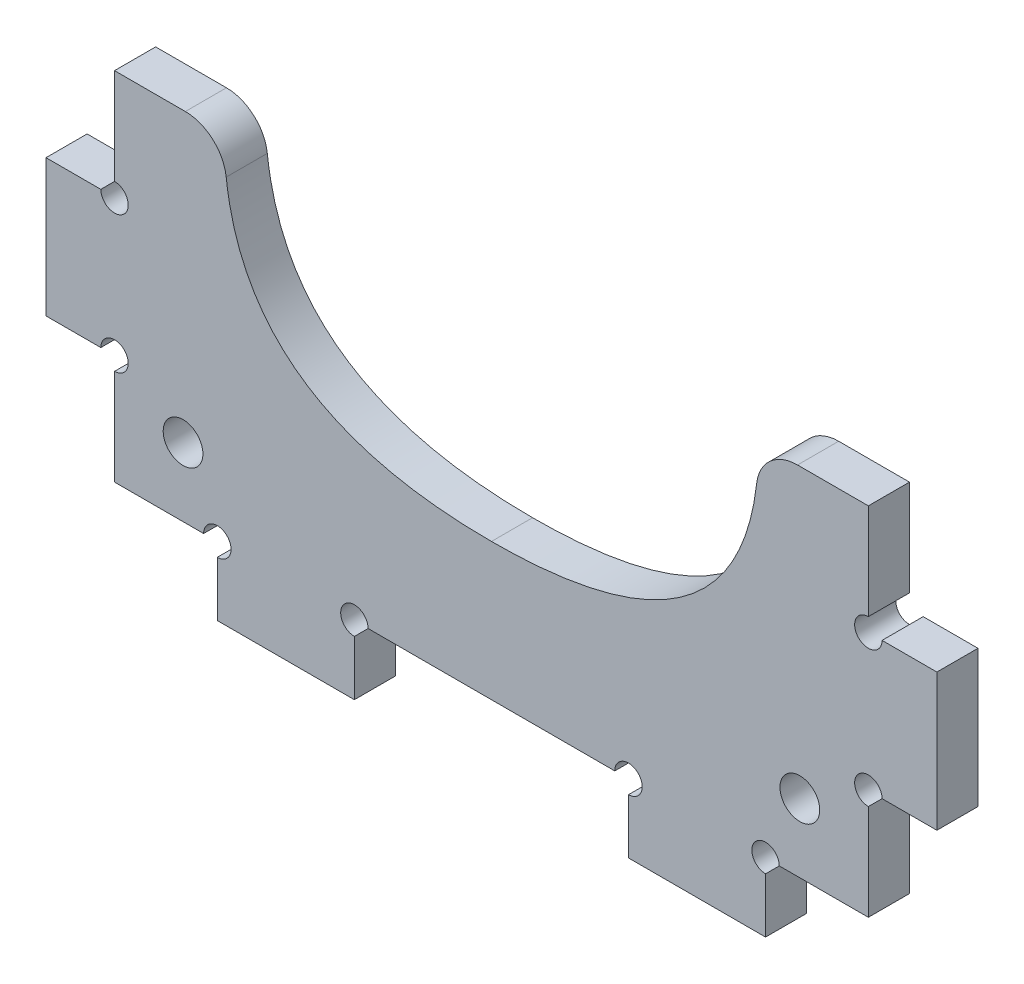
ISO-10303-21;
HEADER;
FILE_DESCRIPTION(('STEP AP214'),'2;1');
FILE_NAME('part.step','',(''),(''),'','','');
FILE_SCHEMA(('AUTOMOTIVE_DESIGN { 1 0 10303 214 1 1 1 1 }'));
ENDSEC;
DATA;
#1=APPLICATION_CONTEXT('core data for automotive mechanical design processes');
#2=APPLICATION_PROTOCOL_DEFINITION('international standard','automotive_design',2000,#1);
#3=PRODUCT_CONTEXT('',#1,'mechanical');
#4=PRODUCT('Part','Part','',(#3));
#5=PRODUCT_RELATED_PRODUCT_CATEGORY('part','',(#4));
#6=PRODUCT_DEFINITION_FORMATION('','',#4);
#7=PRODUCT_DEFINITION_CONTEXT('part definition',#1,'design');
#8=PRODUCT_DEFINITION('design','',#6,#7);
#9=PRODUCT_DEFINITION_SHAPE('','',#8);
#10=(LENGTH_UNIT() NAMED_UNIT(*) SI_UNIT(.MILLI.,.METRE.));
#11=(NAMED_UNIT(*) PLANE_ANGLE_UNIT() SI_UNIT($,.RADIAN.));
#12=(NAMED_UNIT(*) SI_UNIT($,.STERADIAN.) SOLID_ANGLE_UNIT());
#13=UNCERTAINTY_MEASURE_WITH_UNIT(LENGTH_MEASURE(1.E-05),#10,'distance_accuracy_value','');
#14=(GEOMETRIC_REPRESENTATION_CONTEXT(3) GLOBAL_UNCERTAINTY_ASSIGNED_CONTEXT((#13)) GLOBAL_UNIT_ASSIGNED_CONTEXT((#10,
#11,#12)) REPRESENTATION_CONTEXT('',''));
#15=CARTESIAN_POINT('',(0.,0.,0.));
#16=DIRECTION('',(0.,0.,1.));
#17=DIRECTION('',(1.,0.,0.));
#18=AXIS2_PLACEMENT_3D('',#15,#16,#17);
#19=CARTESIAN_POINT('',(14.625,14.,3.));
#20=DIRECTION('',(0.,0.,1.));
#21=DIRECTION('',(1.,0.,0.));
#22=AXIS2_PLACEMENT_3D('',#19,#20,#21);
#23=PLANE('',#22);
#24=DIRECTION('',(-1.,0.,0.));
#25=VECTOR('',#24,1.);
#26=CARTESIAN_POINT('',(27.5,26.,3.));
#27=LINE('',#26,#25);
#28=CARTESIAN_POINT('',(27.5,26.,3.));
#29=VERTEX_POINT('',#28);
#30=CARTESIAN_POINT('',(22.3334164182917,26.,3.));
#31=VERTEX_POINT('',#30);
#32=EDGE_CURVE('E622',#29,#31,#27,.T.);
#33=ORIENTED_EDGE('',*,*,#32,.T.);
#34=CARTESIAN_POINT('',(22.3334164182917,23.,3.));
#35=DIRECTION('',(0.,0.,1.));
#36=DIRECTION('',(1.,0.,0.));
#37=AXIS2_PLACEMENT_3D('',#34,#35,#36);
#38=CIRCLE('',#37,3.);
#39=CARTESIAN_POINT('',(19.3533116213821,23.3449281076346,3.));
#40=VERTEX_POINT('',#39);
#41=EDGE_CURVE('E478',#31,#40,#38,.T.);
#42=ORIENTED_EDGE('',*,*,#41,.T.);
#43=CARTESIAN_POINT('',(19.5,26.,3.));
#44=CARTESIAN_POINT('',(19.5,10.,3.));
#45=CARTESIAN_POINT('',(0.,10.,3.));
#46=B_SPLINE_CURVE_WITH_KNOTS('',2,(#43,#44,#45),.UNSPECIFIED.,.F.,.F.,(3,3),(0.,1.),.UNSPECIFIED.);
#47=CARTESIAN_POINT('',(0.,10.,3.));
#48=VERTEX_POINT('',#47);
#49=EDGE_CURVE('E625',#40,#48,#46,.T.);
#50=ORIENTED_EDGE('',*,*,#49,.T.);
#51=CARTESIAN_POINT('',(0.,10.,3.));
#52=CARTESIAN_POINT('',(-19.5,10.,3.));
#53=CARTESIAN_POINT('',(-19.5,26.,3.));
#54=B_SPLINE_CURVE_WITH_KNOTS('',2,(#51,#52,#53),.UNSPECIFIED.,.F.,.F.,(3,3),(0.,1.),.UNSPECIFIED.);
#55=CARTESIAN_POINT('',(-19.3533116213821,23.3449281076346,3.));
#56=VERTEX_POINT('',#55);
#57=EDGE_CURVE('E513',#48,#56,#54,.T.);
#58=ORIENTED_EDGE('',*,*,#57,.T.);
#59=CARTESIAN_POINT('',(-22.3334164182917,23.,3.));
#60=DIRECTION('',(0.,0.,1.));
#61=DIRECTION('',(1.,0.,0.));
#62=AXIS2_PLACEMENT_3D('',#59,#60,#61);
#63=CIRCLE('',#62,3.);
#64=CARTESIAN_POINT('',(-22.3334164182917,26.,3.));
#65=VERTEX_POINT('',#64);
#66=EDGE_CURVE('E61',#56,#65,#63,.T.);
#67=ORIENTED_EDGE('',*,*,#66,.T.);
#68=DIRECTION('',(-1.,0.,0.));
#69=VECTOR('',#68,1.);
#70=CARTESIAN_POINT('',(-27.5,26.,3.));
#71=LINE('',#70,#69);
#72=CARTESIAN_POINT('',(-27.5,26.,3.));
#73=VERTEX_POINT('',#72);
#74=EDGE_CURVE('E487',#65,#73,#71,.T.);
#75=ORIENTED_EDGE('',*,*,#74,.T.);
#76=DIRECTION('',(0.,-1.,0.));
#77=VECTOR('',#76,1.);
#78=CARTESIAN_POINT('',(-27.5,18.,3.));
#79=LINE('',#78,#77);
#80=CARTESIAN_POINT('',(-27.5,19.,3.));
#81=VERTEX_POINT('',#80);
#82=EDGE_CURVE('E504',#73,#81,#79,.T.);
#83=ORIENTED_EDGE('',*,*,#82,.T.);
#84=CARTESIAN_POINT('',(-27.5,18.,3.));
#85=DIRECTION('',(0.,0.,1.));
#86=DIRECTION('',(1.,0.,0.));
#87=AXIS2_PLACEMENT_3D('',#84,#85,#86);
#88=CIRCLE('',#87,1.);
#89=CARTESIAN_POINT('',(-28.5,18.,3.));
#90=VERTEX_POINT('',#89);
#91=EDGE_CURVE('E573',#90,#81,#88,.T.);
#92=ORIENTED_EDGE('',*,*,#91,.F.);
#93=DIRECTION('',(-1.,0.,0.));
#94=VECTOR('',#93,1.);
#95=CARTESIAN_POINT('',(-32.5,18.,3.));
#96=LINE('',#95,#94);
#97=CARTESIAN_POINT('',(-32.5,18.,3.));
#98=VERTEX_POINT('',#97);
#99=EDGE_CURVE('E507',#90,#98,#96,.T.);
#100=ORIENTED_EDGE('',*,*,#99,.T.);
#101=DIRECTION('',(0.,-1.,0.));
#102=VECTOR('',#101,1.);
#103=CARTESIAN_POINT('',(-32.5,8.,3.));
#104=LINE('',#103,#102);
#105=CARTESIAN_POINT('',(-32.5,8.,3.));
#106=VERTEX_POINT('',#105);
#107=EDGE_CURVE('E511',#98,#106,#104,.T.);
#108=ORIENTED_EDGE('',*,*,#107,.T.);
#109=DIRECTION('',(1.,0.,0.));
#110=VECTOR('',#109,1.);
#111=CARTESIAN_POINT('',(-27.5,8.,3.));
#112=LINE('',#111,#110);
#113=CARTESIAN_POINT('',(-28.5,8.,3.));
#114=VERTEX_POINT('',#113);
#115=EDGE_CURVE('E519',#106,#114,#112,.T.);
#116=ORIENTED_EDGE('',*,*,#115,.T.);
#117=CARTESIAN_POINT('',(-27.5,8.,3.));
#118=DIRECTION('',(0.,0.,1.));
#119=DIRECTION('',(1.,0.,0.));
#120=AXIS2_PLACEMENT_3D('',#117,#118,#119);
#121=CIRCLE('',#120,1.);
#122=CARTESIAN_POINT('',(-27.5,7.,3.));
#123=VERTEX_POINT('',#122);
#124=EDGE_CURVE('E794',#123,#114,#121,.T.);
#125=ORIENTED_EDGE('',*,*,#124,.F.);
#126=DIRECTION('',(0.,-1.,0.));
#127=VECTOR('',#126,1.);
#128=CARTESIAN_POINT('',(-27.5,0.,3.));
#129=LINE('',#128,#127);
#130=CARTESIAN_POINT('',(-27.5,0.,3.));
#131=VERTEX_POINT('',#130);
#132=EDGE_CURVE('E523',#123,#131,#129,.T.);
#133=ORIENTED_EDGE('',*,*,#132,.T.);
#134=DIRECTION('',(1.,0.,0.));
#135=VECTOR('',#134,1.);
#136=CARTESIAN_POINT('',(-20.,0.,3.));
#137=LINE('',#136,#135);
#138=CARTESIAN_POINT('',(-21.,0.,3.));
#139=VERTEX_POINT('',#138);
#140=EDGE_CURVE('E526',#131,#139,#137,.T.);
#141=ORIENTED_EDGE('',*,*,#140,.T.);
#142=CARTESIAN_POINT('',(-20.,0.,3.));
#143=DIRECTION('',(0.,0.,1.));
#144=DIRECTION('',(1.,0.,0.));
#145=AXIS2_PLACEMENT_3D('',#142,#143,#144);
#146=CIRCLE('',#145,1.);
#147=CARTESIAN_POINT('',(-20.,-1.,3.));
#148=VERTEX_POINT('',#147);
#149=EDGE_CURVE('E787',#148,#139,#146,.T.);
#150=ORIENTED_EDGE('',*,*,#149,.F.);
#151=DIRECTION('',(0.,-1.,0.));
#152=VECTOR('',#151,1.);
#153=CARTESIAN_POINT('',(-20.,-5.,3.));
#154=LINE('',#153,#152);
#155=CARTESIAN_POINT('',(-20.,-5.,3.));
#156=VERTEX_POINT('',#155);
#157=EDGE_CURVE('E530',#148,#156,#154,.T.);
#158=ORIENTED_EDGE('',*,*,#157,.T.);
#159=DIRECTION('',(1.,0.,0.));
#160=VECTOR('',#159,1.);
#161=CARTESIAN_POINT('',(-10.,-5.,3.));
#162=LINE('',#161,#160);
#163=CARTESIAN_POINT('',(-10.,-5.,3.));
#164=VERTEX_POINT('',#163);
#165=EDGE_CURVE('E533',#156,#164,#162,.T.);
#166=ORIENTED_EDGE('',*,*,#165,.T.);
#167=DIRECTION('',(0.,1.,0.));
#168=VECTOR('',#167,1.);
#169=CARTESIAN_POINT('',(-10.,0.,3.));
#170=LINE('',#169,#168);
#171=CARTESIAN_POINT('',(-10.,-1.,3.));
#172=VERTEX_POINT('',#171);
#173=EDGE_CURVE('E536',#164,#172,#170,.T.);
#174=ORIENTED_EDGE('',*,*,#173,.T.);
#175=CARTESIAN_POINT('',(-10.,0.,3.));
#176=DIRECTION('',(0.,0.,1.));
#177=DIRECTION('',(1.,0.,0.));
#178=AXIS2_PLACEMENT_3D('',#175,#176,#177);
#179=CIRCLE('',#178,1.);
#180=CARTESIAN_POINT('',(-9.,0.,3.));
#181=VERTEX_POINT('',#180);
#182=EDGE_CURVE('E780',#181,#172,#179,.T.);
#183=ORIENTED_EDGE('',*,*,#182,.F.);
#184=DIRECTION('',(1.,0.,0.));
#185=VECTOR('',#184,1.);
#186=CARTESIAN_POINT('',(-10.,0.,3.));
#187=LINE('',#186,#185);
#188=CARTESIAN_POINT('',(9.,0.,3.));
#189=VERTEX_POINT('',#188);
#190=EDGE_CURVE('E540',#181,#189,#187,.T.);
#191=ORIENTED_EDGE('',*,*,#190,.T.);
#192=CARTESIAN_POINT('',(10.,0.,3.));
#193=DIRECTION('',(0.,0.,1.));
#194=DIRECTION('',(1.,0.,0.));
#195=AXIS2_PLACEMENT_3D('',#192,#193,#194);
#196=CIRCLE('',#195,1.);
#197=CARTESIAN_POINT('',(10.,-1.,3.));
#198=VERTEX_POINT('',#197);
#199=EDGE_CURVE('E773',#198,#189,#196,.T.);
#200=ORIENTED_EDGE('',*,*,#199,.F.);
#201=DIRECTION('',(0.,-1.,0.));
#202=VECTOR('',#201,1.);
#203=CARTESIAN_POINT('',(10.,0.,3.));
#204=LINE('',#203,#202);
#205=CARTESIAN_POINT('',(10.,-5.,3.));
#206=VERTEX_POINT('',#205);
#207=EDGE_CURVE('E544',#198,#206,#204,.T.);
#208=ORIENTED_EDGE('',*,*,#207,.T.);
#209=DIRECTION('',(1.,0.,0.));
#210=VECTOR('',#209,1.);
#211=CARTESIAN_POINT('',(10.,-5.,3.));
#212=LINE('',#211,#210);
#213=CARTESIAN_POINT('',(20.,-5.,3.));
#214=VERTEX_POINT('',#213);
#215=EDGE_CURVE('E547',#206,#214,#212,.T.);
#216=ORIENTED_EDGE('',*,*,#215,.T.);
#217=DIRECTION('',(0.,1.,0.));
#218=VECTOR('',#217,1.);
#219=CARTESIAN_POINT('',(20.,-5.,3.));
#220=LINE('',#219,#218);
#221=CARTESIAN_POINT('',(20.,-1.,3.));
#222=VERTEX_POINT('',#221);
#223=EDGE_CURVE('E550',#214,#222,#220,.T.);
#224=ORIENTED_EDGE('',*,*,#223,.T.);
#225=CARTESIAN_POINT('',(20.,0.,3.));
#226=DIRECTION('',(0.,0.,1.));
#227=DIRECTION('',(1.,0.,0.));
#228=AXIS2_PLACEMENT_3D('',#225,#226,#227);
#229=CIRCLE('',#228,1.);
#230=CARTESIAN_POINT('',(21.,0.,3.));
#231=VERTEX_POINT('',#230);
#232=EDGE_CURVE('E557',#231,#222,#229,.T.);
#233=ORIENTED_EDGE('',*,*,#232,.F.);
#234=DIRECTION('',(1.,0.,0.));
#235=VECTOR('',#234,1.);
#236=CARTESIAN_POINT('',(20.,0.,3.));
#237=LINE('',#236,#235);
#238=CARTESIAN_POINT('',(27.5,0.,3.));
#239=VERTEX_POINT('',#238);
#240=EDGE_CURVE('E295',#231,#239,#237,.T.);
#241=ORIENTED_EDGE('',*,*,#240,.T.);
#242=DIRECTION('',(0.,1.,0.));
#243=VECTOR('',#242,1.);
#244=CARTESIAN_POINT('',(27.5,0.,3.));
#245=LINE('',#244,#243);
#246=CARTESIAN_POINT('',(27.5,7.,3.));
#247=VERTEX_POINT('',#246);
#248=EDGE_CURVE('E281',#239,#247,#245,.T.);
#249=ORIENTED_EDGE('',*,*,#248,.T.);
#250=CARTESIAN_POINT('',(27.5,8.,3.));
#251=DIRECTION('',(0.,0.,1.));
#252=DIRECTION('',(1.,0.,0.));
#253=AXIS2_PLACEMENT_3D('',#250,#251,#252);
#254=CIRCLE('',#253,1.);
#255=CARTESIAN_POINT('',(28.5,8.,3.));
#256=VERTEX_POINT('',#255);
#257=EDGE_CURVE('E263',#256,#247,#254,.T.);
#258=ORIENTED_EDGE('',*,*,#257,.F.);
#259=DIRECTION('',(1.,0.,0.));
#260=VECTOR('',#259,1.);
#261=CARTESIAN_POINT('',(27.5,8.,3.));
#262=LINE('',#261,#260);
#263=CARTESIAN_POINT('',(32.5,8.,3.));
#264=VERTEX_POINT('',#263);
#265=EDGE_CURVE('E278',#256,#264,#262,.T.);
#266=ORIENTED_EDGE('',*,*,#265,.T.);
#267=DIRECTION('',(0.,1.,0.));
#268=VECTOR('',#267,1.);
#269=CARTESIAN_POINT('',(32.5,8.,3.));
#270=LINE('',#269,#268);
#271=CARTESIAN_POINT('',(32.5,18.,3.));
#272=VERTEX_POINT('',#271);
#273=EDGE_CURVE('E388',#264,#272,#270,.T.);
#274=ORIENTED_EDGE('',*,*,#273,.T.);
#275=DIRECTION('',(-1.,0.,0.));
#276=VECTOR('',#275,1.);
#277=CARTESIAN_POINT('',(32.5,18.,3.));
#278=LINE('',#277,#276);
#279=CARTESIAN_POINT('',(28.5,18.,3.));
#280=VERTEX_POINT('',#279);
#281=EDGE_CURVE('E615',#272,#280,#278,.T.);
#282=ORIENTED_EDGE('',*,*,#281,.T.);
#283=CARTESIAN_POINT('',(27.5,18.,3.));
#284=DIRECTION('',(0.,0.,1.));
#285=DIRECTION('',(1.,0.,0.));
#286=AXIS2_PLACEMENT_3D('',#283,#284,#285);
#287=CIRCLE('',#286,1.);
#288=CARTESIAN_POINT('',(27.5,19.,3.));
#289=VERTEX_POINT('',#288);
#290=EDGE_CURVE('E751',#289,#280,#287,.T.);
#291=ORIENTED_EDGE('',*,*,#290,.F.);
#292=DIRECTION('',(0.,1.,0.));
#293=VECTOR('',#292,1.);
#294=CARTESIAN_POINT('',(27.5,18.,3.));
#295=LINE('',#294,#293);
#296=EDGE_CURVE('E619',#289,#29,#295,.T.);
#297=ORIENTED_EDGE('',*,*,#296,.T.);
#298=EDGE_LOOP('',(#33,#42,#50,#58,#67,#75,#83,#92,#100,#108,#116,#125,#133,#141,#150,#158,#166,
#174,#183,#191,#200,#208,#216,#224,#233,#241,#249,#258,#266,#274,#282,#291,#297));
#299=FACE_BOUND('',#298,.T.);
#300=CARTESIAN_POINT('',(22.5,5.,3.));
#301=DIRECTION('',(0.,0.,1.));
#302=DIRECTION('',(1.,0.,0.));
#303=AXIS2_PLACEMENT_3D('',#300,#301,#302);
#304=CIRCLE('',#303,1.45);
#305=CARTESIAN_POINT('',(23.95,5.,3.));
#306=VERTEX_POINT('',#305);
#307=EDGE_CURVE('E304',#306,#306,#304,.T.);
#308=ORIENTED_EDGE('',*,*,#307,.F.);
#309=EDGE_LOOP('',(#308));
#310=FACE_BOUND('',#309,.T.);
#311=CARTESIAN_POINT('',(-22.5,5.,3.));
#312=DIRECTION('',(0.,0.,1.));
#313=DIRECTION('',(-1.,0.,0.));
#314=AXIS2_PLACEMENT_3D('',#311,#312,#313);
#315=CIRCLE('',#314,1.45);
#316=CARTESIAN_POINT('',(-23.95,5.,3.));
#317=VERTEX_POINT('',#316);
#318=EDGE_CURVE('E599',#317,#317,#315,.T.);
#319=ORIENTED_EDGE('',*,*,#318,.F.);
#320=EDGE_LOOP('',(#319));
#321=FACE_BOUND('',#320,.T.);
#322=ADVANCED_FACE('F45',(#299,#310,#321),#23,.T.);
#323=CARTESIAN_POINT('',(14.625,14.,0.));
#324=DIRECTION('',(0.,0.,1.));
#325=DIRECTION('',(1.,0.,0.));
#326=AXIS2_PLACEMENT_3D('',#323,#324,#325);
#327=PLANE('',#326);
#328=CARTESIAN_POINT('',(19.5,26.,0.));
#329=CARTESIAN_POINT('',(19.5,10.,0.));
#330=CARTESIAN_POINT('',(0.,10.,0.));
#331=B_SPLINE_CURVE_WITH_KNOTS('',2,(#328,#329,#330),.UNSPECIFIED.,.F.,.F.,(3,3),(0.,1.),.UNSPECIFIED.);
#332=CARTESIAN_POINT('',(19.3533116213821,23.3449281076346,0.));
#333=VERTEX_POINT('',#332);
#334=CARTESIAN_POINT('',(0.,10.,0.));
#335=VERTEX_POINT('',#334);
#336=EDGE_CURVE('E315',#333,#335,#331,.T.);
#337=ORIENTED_EDGE('',*,*,#336,.F.);
#338=CARTESIAN_POINT('',(22.3334164182917,23.,0.));
#339=DIRECTION('',(0.,0.,1.));
#340=DIRECTION('',(1.,0.,0.));
#341=AXIS2_PLACEMENT_3D('',#338,#339,#340);
#342=CIRCLE('',#341,3.);
#343=CARTESIAN_POINT('',(22.3334164182917,26.,0.));
#344=VERTEX_POINT('',#343);
#345=EDGE_CURVE('E470',#333,#344,#342,.F.);
#346=ORIENTED_EDGE('',*,*,#345,.T.);
#347=DIRECTION('',(-1.,0.,0.));
#348=VECTOR('',#347,1.);
#349=CARTESIAN_POINT('',(27.5,26.,0.));
#350=LINE('',#349,#348);
#351=CARTESIAN_POINT('',(27.5,26.,0.));
#352=VERTEX_POINT('',#351);
#353=EDGE_CURVE('E311',#352,#344,#350,.T.);
#354=ORIENTED_EDGE('',*,*,#353,.F.);
#355=DIRECTION('',(0.,1.,0.));
#356=VECTOR('',#355,1.);
#357=CARTESIAN_POINT('',(27.5,18.,0.));
#358=LINE('',#357,#356);
#359=CARTESIAN_POINT('',(27.5,19.,0.));
#360=VERTEX_POINT('',#359);
#361=EDGE_CURVE('E308',#360,#352,#358,.T.);
#362=ORIENTED_EDGE('',*,*,#361,.F.);
#363=CARTESIAN_POINT('',(27.5,18.,0.));
#364=DIRECTION('',(0.,0.,1.));
#365=DIRECTION('',(1.,0.,0.));
#366=AXIS2_PLACEMENT_3D('',#363,#364,#365);
#367=CIRCLE('',#366,1.);
#368=CARTESIAN_POINT('',(28.5,18.,0.));
#369=VERTEX_POINT('',#368);
#370=EDGE_CURVE('E754',#360,#369,#367,.T.);
#371=ORIENTED_EDGE('',*,*,#370,.T.);
#372=DIRECTION('',(-1.,0.,0.));
#373=VECTOR('',#372,1.);
#374=CARTESIAN_POINT('',(32.5,18.,0.));
#375=LINE('',#374,#373);
#376=CARTESIAN_POINT('',(32.5,18.,0.));
#377=VERTEX_POINT('',#376);
#378=EDGE_CURVE('E303',#377,#369,#375,.T.);
#379=ORIENTED_EDGE('',*,*,#378,.F.);
#380=DIRECTION('',(0.,1.,0.));
#381=VECTOR('',#380,1.);
#382=CARTESIAN_POINT('',(32.5,8.,0.));
#383=LINE('',#382,#381);
#384=CARTESIAN_POINT('',(32.5,8.,0.));
#385=VERTEX_POINT('',#384);
#386=EDGE_CURVE('E299',#385,#377,#383,.T.);
#387=ORIENTED_EDGE('',*,*,#386,.F.);
#388=DIRECTION('',(1.,0.,0.));
#389=VECTOR('',#388,1.);
#390=CARTESIAN_POINT('',(27.5,8.,0.));
#391=LINE('',#390,#389);
#392=CARTESIAN_POINT('',(28.5,8.,0.));
#393=VERTEX_POINT('',#392);
#394=EDGE_CURVE('E386',#393,#385,#391,.T.);
#395=ORIENTED_EDGE('',*,*,#394,.F.);
#396=CARTESIAN_POINT('',(27.5,8.,0.));
#397=DIRECTION('',(0.,0.,1.));
#398=DIRECTION('',(1.,0.,0.));
#399=AXIS2_PLACEMENT_3D('',#396,#397,#398);
#400=CIRCLE('',#399,1.);
#401=CARTESIAN_POINT('',(27.5,7.,0.));
#402=VERTEX_POINT('',#401);
#403=EDGE_CURVE('E266',#393,#402,#400,.T.);
#404=ORIENTED_EDGE('',*,*,#403,.T.);
#405=DIRECTION('',(0.,1.,0.));
#406=VECTOR('',#405,1.);
#407=CARTESIAN_POINT('',(27.5,0.,0.));
#408=LINE('',#407,#406);
#409=CARTESIAN_POINT('',(27.5,0.,0.));
#410=VERTEX_POINT('',#409);
#411=EDGE_CURVE('E382',#410,#402,#408,.T.);
#412=ORIENTED_EDGE('',*,*,#411,.F.);
#413=DIRECTION('',(1.,0.,0.));
#414=VECTOR('',#413,1.);
#415=CARTESIAN_POINT('',(20.,0.,0.));
#416=LINE('',#415,#414);
#417=CARTESIAN_POINT('',(21.,0.,0.));
#418=VERTEX_POINT('',#417);
#419=EDGE_CURVE('E379',#418,#410,#416,.T.);
#420=ORIENTED_EDGE('',*,*,#419,.F.);
#421=CARTESIAN_POINT('',(20.,0.,0.));
#422=DIRECTION('',(0.,0.,1.));
#423=DIRECTION('',(1.,0.,0.));
#424=AXIS2_PLACEMENT_3D('',#421,#422,#423);
#425=CIRCLE('',#424,1.);
#426=CARTESIAN_POINT('',(20.,-1.,0.));
#427=VERTEX_POINT('',#426);
#428=EDGE_CURVE('E283',#418,#427,#425,.T.);
#429=ORIENTED_EDGE('',*,*,#428,.T.);
#430=DIRECTION('',(0.,1.,0.));
#431=VECTOR('',#430,1.);
#432=CARTESIAN_POINT('',(20.,-5.,0.));
#433=LINE('',#432,#431);
#434=CARTESIAN_POINT('',(20.,-5.,0.));
#435=VERTEX_POINT('',#434);
#436=EDGE_CURVE('E375',#435,#427,#433,.T.);
#437=ORIENTED_EDGE('',*,*,#436,.F.);
#438=DIRECTION('',(1.,0.,0.));
#439=VECTOR('',#438,1.);
#440=CARTESIAN_POINT('',(10.,-5.,0.));
#441=LINE('',#440,#439);
#442=CARTESIAN_POINT('',(10.,-5.,0.));
#443=VERTEX_POINT('',#442);
#444=EDGE_CURVE('E372',#443,#435,#441,.T.);
#445=ORIENTED_EDGE('',*,*,#444,.F.);
#446=DIRECTION('',(0.,-1.,0.));
#447=VECTOR('',#446,1.);
#448=CARTESIAN_POINT('',(10.,0.,0.));
#449=LINE('',#448,#447);
#450=CARTESIAN_POINT('',(10.,-1.,0.));
#451=VERTEX_POINT('',#450);
#452=EDGE_CURVE('E369',#451,#443,#449,.T.);
#453=ORIENTED_EDGE('',*,*,#452,.F.);
#454=CARTESIAN_POINT('',(10.,0.,0.));
#455=DIRECTION('',(0.,0.,1.));
#456=DIRECTION('',(1.,0.,0.));
#457=AXIS2_PLACEMENT_3D('',#454,#455,#456);
#458=CIRCLE('',#457,1.);
#459=CARTESIAN_POINT('',(9.,0.,0.));
#460=VERTEX_POINT('',#459);
#461=EDGE_CURVE('E769',#451,#460,#458,.T.);
#462=ORIENTED_EDGE('',*,*,#461,.T.);
#463=DIRECTION('',(1.,0.,0.));
#464=VECTOR('',#463,1.);
#465=CARTESIAN_POINT('',(-10.,0.,0.));
#466=LINE('',#465,#464);
#467=CARTESIAN_POINT('',(-9.,0.,0.));
#468=VERTEX_POINT('',#467);
#469=EDGE_CURVE('E365',#468,#460,#466,.T.);
#470=ORIENTED_EDGE('',*,*,#469,.F.);
#471=CARTESIAN_POINT('',(-10.,0.,0.));
#472=DIRECTION('',(0.,0.,1.));
#473=DIRECTION('',(1.,0.,0.));
#474=AXIS2_PLACEMENT_3D('',#471,#472,#473);
#475=CIRCLE('',#474,1.);
#476=CARTESIAN_POINT('',(-10.,-1.,0.));
#477=VERTEX_POINT('',#476);
#478=EDGE_CURVE('E776',#468,#477,#475,.T.);
#479=ORIENTED_EDGE('',*,*,#478,.T.);
#480=DIRECTION('',(0.,1.,0.));
#481=VECTOR('',#480,1.);
#482=CARTESIAN_POINT('',(-10.,0.,0.));
#483=LINE('',#482,#481);
#484=CARTESIAN_POINT('',(-10.,-5.,0.));
#485=VERTEX_POINT('',#484);
#486=EDGE_CURVE('E361',#485,#477,#483,.T.);
#487=ORIENTED_EDGE('',*,*,#486,.F.);
#488=DIRECTION('',(1.,0.,0.));
#489=VECTOR('',#488,1.);
#490=CARTESIAN_POINT('',(-10.,-5.,0.));
#491=LINE('',#490,#489);
#492=CARTESIAN_POINT('',(-20.,-5.,0.));
#493=VERTEX_POINT('',#492);
#494=EDGE_CURVE('E358',#493,#485,#491,.T.);
#495=ORIENTED_EDGE('',*,*,#494,.F.);
#496=DIRECTION('',(0.,-1.,0.));
#497=VECTOR('',#496,1.);
#498=CARTESIAN_POINT('',(-20.,-5.,0.));
#499=LINE('',#498,#497);
#500=CARTESIAN_POINT('',(-20.,-1.,0.));
#501=VERTEX_POINT('',#500);
#502=EDGE_CURVE('E355',#501,#493,#499,.T.);
#503=ORIENTED_EDGE('',*,*,#502,.F.);
#504=CARTESIAN_POINT('',(-20.,0.,0.));
#505=DIRECTION('',(0.,0.,1.));
#506=DIRECTION('',(1.,0.,0.));
#507=AXIS2_PLACEMENT_3D('',#504,#505,#506);
#508=CIRCLE('',#507,1.);
#509=CARTESIAN_POINT('',(-21.,0.,0.));
#510=VERTEX_POINT('',#509);
#511=EDGE_CURVE('E783',#501,#510,#508,.T.);
#512=ORIENTED_EDGE('',*,*,#511,.T.);
#513=DIRECTION('',(1.,0.,0.));
#514=VECTOR('',#513,1.);
#515=CARTESIAN_POINT('',(-20.,0.,0.));
#516=LINE('',#515,#514);
#517=CARTESIAN_POINT('',(-27.5,0.,0.));
#518=VERTEX_POINT('',#517);
#519=EDGE_CURVE('E351',#518,#510,#516,.T.);
#520=ORIENTED_EDGE('',*,*,#519,.F.);
#521=DIRECTION('',(0.,-1.,0.));
#522=VECTOR('',#521,1.);
#523=CARTESIAN_POINT('',(-27.5,0.,0.));
#524=LINE('',#523,#522);
#525=CARTESIAN_POINT('',(-27.5,7.,0.));
#526=VERTEX_POINT('',#525);
#527=EDGE_CURVE('E348',#526,#518,#524,.T.);
#528=ORIENTED_EDGE('',*,*,#527,.F.);
#529=CARTESIAN_POINT('',(-27.5,8.,0.));
#530=DIRECTION('',(0.,0.,1.));
#531=DIRECTION('',(1.,0.,0.));
#532=AXIS2_PLACEMENT_3D('',#529,#530,#531);
#533=CIRCLE('',#532,1.);
#534=CARTESIAN_POINT('',(-28.5,8.,0.));
#535=VERTEX_POINT('',#534);
#536=EDGE_CURVE('E790',#526,#535,#533,.T.);
#537=ORIENTED_EDGE('',*,*,#536,.T.);
#538=DIRECTION('',(1.,0.,0.));
#539=VECTOR('',#538,1.);
#540=CARTESIAN_POINT('',(-27.5,8.,0.));
#541=LINE('',#540,#539);
#542=CARTESIAN_POINT('',(-32.5,8.,0.));
#543=VERTEX_POINT('',#542);
#544=EDGE_CURVE('E344',#543,#535,#541,.T.);
#545=ORIENTED_EDGE('',*,*,#544,.F.);
#546=DIRECTION('',(0.,-1.,0.));
#547=VECTOR('',#546,1.);
#548=CARTESIAN_POINT('',(-32.5,8.,0.));
#549=LINE('',#548,#547);
#550=CARTESIAN_POINT('',(-32.5,18.,0.));
#551=VERTEX_POINT('',#550);
#552=EDGE_CURVE('E341',#551,#543,#549,.T.);
#553=ORIENTED_EDGE('',*,*,#552,.F.);
#554=DIRECTION('',(-1.,0.,0.));
#555=VECTOR('',#554,1.);
#556=CARTESIAN_POINT('',(-32.5,18.,0.));
#557=LINE('',#556,#555);
#558=CARTESIAN_POINT('',(-28.5,18.,0.));
#559=VERTEX_POINT('',#558);
#560=EDGE_CURVE('E338',#559,#551,#557,.T.);
#561=ORIENTED_EDGE('',*,*,#560,.F.);
#562=CARTESIAN_POINT('',(-27.5,18.,0.));
#563=DIRECTION('',(0.,0.,1.));
#564=DIRECTION('',(1.,0.,0.));
#565=AXIS2_PLACEMENT_3D('',#562,#563,#564);
#566=CIRCLE('',#565,1.);
#567=CARTESIAN_POINT('',(-27.5,19.,0.));
#568=VERTEX_POINT('',#567);
#569=EDGE_CURVE('E497',#559,#568,#566,.T.);
#570=ORIENTED_EDGE('',*,*,#569,.T.);
#571=DIRECTION('',(0.,-1.,0.));
#572=VECTOR('',#571,1.);
#573=CARTESIAN_POINT('',(-27.5,18.,0.));
#574=LINE('',#573,#572);
#575=CARTESIAN_POINT('',(-27.5,26.,0.));
#576=VERTEX_POINT('',#575);
#577=EDGE_CURVE('E334',#576,#568,#574,.T.);
#578=ORIENTED_EDGE('',*,*,#577,.F.);
#579=DIRECTION('',(-1.,0.,0.));
#580=VECTOR('',#579,1.);
#581=CARTESIAN_POINT('',(-27.5,26.,0.));
#582=LINE('',#581,#580);
#583=CARTESIAN_POINT('',(-22.3334164182917,26.,0.));
#584=VERTEX_POINT('',#583);
#585=EDGE_CURVE('E328',#584,#576,#582,.T.);
#586=ORIENTED_EDGE('',*,*,#585,.F.);
#587=CARTESIAN_POINT('',(-22.3334164182917,23.,0.));
#588=DIRECTION('',(0.,0.,1.));
#589=DIRECTION('',(1.,0.,0.));
#590=AXIS2_PLACEMENT_3D('',#587,#588,#589);
#591=CIRCLE('',#590,3.);
#592=CARTESIAN_POINT('',(-19.3533116213821,23.3449281076346,0.));
#593=VERTEX_POINT('',#592);
#594=EDGE_CURVE('E467',#584,#593,#591,.F.);
#595=ORIENTED_EDGE('',*,*,#594,.T.);
#596=CARTESIAN_POINT('',(0.,10.,0.));
#597=CARTESIAN_POINT('',(-19.5,10.,0.));
#598=CARTESIAN_POINT('',(-19.5,26.,0.));
#599=B_SPLINE_CURVE_WITH_KNOTS('',2,(#596,#597,#598),.UNSPECIFIED.,.F.,.F.,(3,3),(0.,1.),.UNSPECIFIED.);
#600=EDGE_CURVE('E320',#335,#593,#599,.T.);
#601=ORIENTED_EDGE('',*,*,#600,.F.);
#602=EDGE_LOOP('',(#337,#346,#354,#362,#371,#379,#387,#395,#404,#412,#420,#429,#437,#445,#453,
#462,#470,#479,#487,#495,#503,#512,#520,#528,#537,#545,#553,#561,#570,#578,#586,#595,#601));
#603=FACE_BOUND('',#602,.T.);
#604=CARTESIAN_POINT('',(22.5,5.,0.));
#605=DIRECTION('',(0.,0.,1.));
#606=DIRECTION('',(1.,0.,0.));
#607=AXIS2_PLACEMENT_3D('',#604,#605,#606);
#608=CIRCLE('',#607,1.45);
#609=CARTESIAN_POINT('',(23.95,5.,0.));
#610=VERTEX_POINT('',#609);
#611=EDGE_CURVE('E603',#610,#610,#608,.T.);
#612=ORIENTED_EDGE('',*,*,#611,.T.);
#613=EDGE_LOOP('',(#612));
#614=FACE_BOUND('',#613,.T.);
#615=CARTESIAN_POINT('',(-22.5,5.,0.));
#616=DIRECTION('',(0.,0.,1.));
#617=DIRECTION('',(-1.,0.,0.));
#618=AXIS2_PLACEMENT_3D('',#615,#616,#617);
#619=CIRCLE('',#618,1.45);
#620=CARTESIAN_POINT('',(-23.95,5.,0.));
#621=VERTEX_POINT('',#620);
#622=EDGE_CURVE('E598',#621,#621,#619,.T.);
#623=ORIENTED_EDGE('',*,*,#622,.T.);
#624=EDGE_LOOP('',(#623));
#625=FACE_BOUND('',#624,.T.);
#626=ADVANCED_FACE('F492',(#603,#614,#625),#327,.F.);
#627=CARTESIAN_POINT('',(32.5,8.,3.));
#628=DIRECTION('',(-1.,0.,0.));
#629=DIRECTION('',(0.,0.,1.));
#630=AXIS2_PLACEMENT_3D('',#627,#628,#629);
#631=PLANE('',#630);
#632=ORIENTED_EDGE('',*,*,#386,.T.);
#633=DIRECTION('',(0.,0.,-1.));
#634=VECTOR('',#633,1.);
#635=CARTESIAN_POINT('',(32.5,18.,3.));
#636=LINE('',#635,#634);
#637=EDGE_CURVE('E272',#272,#377,#636,.T.);
#638=ORIENTED_EDGE('',*,*,#637,.F.);
#639=ORIENTED_EDGE('',*,*,#273,.F.);
#640=DIRECTION('',(0.,0.,-1.));
#641=VECTOR('',#640,1.);
#642=CARTESIAN_POINT('',(32.5,8.,3.));
#643=LINE('',#642,#641);
#644=EDGE_CURVE('E287',#264,#385,#643,.T.);
#645=ORIENTED_EDGE('',*,*,#644,.T.);
#646=EDGE_LOOP('',(#632,#638,#639,#645));
#647=FACE_BOUND('',#646,.T.);
#648=ADVANCED_FACE('F655',(#647),#631,.F.);
#649=CARTESIAN_POINT('',(32.5,18.,3.));
#650=DIRECTION('',(0.,-1.,0.));
#651=DIRECTION('',(0.,0.,-1.));
#652=AXIS2_PLACEMENT_3D('',#649,#650,#651);
#653=PLANE('',#652);
#654=ORIENTED_EDGE('',*,*,#378,.T.);
#655=DIRECTION('',(0.,0.,1.));
#656=VECTOR('',#655,1.);
#657=CARTESIAN_POINT('',(28.5,18.,0.));
#658=LINE('',#657,#656);
#659=EDGE_CURVE('E594',#369,#280,#658,.T.);
#660=ORIENTED_EDGE('',*,*,#659,.T.);
#661=ORIENTED_EDGE('',*,*,#281,.F.);
#662=ORIENTED_EDGE('',*,*,#637,.T.);
#663=EDGE_LOOP('',(#654,#660,#661,#662));
#664=FACE_BOUND('',#663,.T.);
#665=ADVANCED_FACE('F651',(#664),#653,.F.);
#666=CARTESIAN_POINT('',(27.5,18.,3.));
#667=DIRECTION('',(-1.,0.,0.));
#668=DIRECTION('',(0.,0.,1.));
#669=AXIS2_PLACEMENT_3D('',#666,#667,#668);
#670=PLANE('',#669);
#671=ORIENTED_EDGE('',*,*,#296,.F.);
#672=DIRECTION('',(0.,0.,1.));
#673=VECTOR('',#672,1.);
#674=CARTESIAN_POINT('',(27.5,19.,0.));
#675=LINE('',#674,#673);
#676=EDGE_CURVE('E459',#289,#360,#675,.F.);
#677=ORIENTED_EDGE('',*,*,#676,.T.);
#678=ORIENTED_EDGE('',*,*,#361,.T.);
#679=DIRECTION('',(0.,0.,-1.));
#680=VECTOR('',#679,1.);
#681=CARTESIAN_POINT('',(27.5,26.,3.));
#682=LINE('',#681,#680);
#683=EDGE_CURVE('E429',#29,#352,#682,.T.);
#684=ORIENTED_EDGE('',*,*,#683,.F.);
#685=EDGE_LOOP('',(#671,#677,#678,#684));
#686=FACE_BOUND('',#685,.T.);
#687=ADVANCED_FACE('F647',(#686),#670,.F.);
#688=CARTESIAN_POINT('',(27.5,26.,3.));
#689=DIRECTION('',(0.,-1.,0.));
#690=DIRECTION('',(0.,0.,-1.));
#691=AXIS2_PLACEMENT_3D('',#688,#689,#690);
#692=PLANE('',#691);
#693=ORIENTED_EDGE('',*,*,#353,.T.);
#694=DIRECTION('',(0.,0.,-1.));
#695=VECTOR('',#694,1.);
#696=CARTESIAN_POINT('',(22.3334164182917,26.,3.));
#697=LINE('',#696,#695);
#698=EDGE_CURVE('E473',#344,#31,#697,.F.);
#699=ORIENTED_EDGE('',*,*,#698,.T.);
#700=ORIENTED_EDGE('',*,*,#32,.F.);
#701=ORIENTED_EDGE('',*,*,#683,.T.);
#702=EDGE_LOOP('',(#693,#699,#700,#701));
#703=FACE_BOUND('',#702,.T.);
#704=ADVANCED_FACE('F642',(#703),#692,.F.);
#705=DIRECTION('',(0.,0.,-1.));
#706=VECTOR('',#705,1.);
#707=SURFACE_OF_LINEAR_EXTRUSION('',#46,#706);
#708=ORIENTED_EDGE('',*,*,#49,.F.);
#709=DIRECTION('',(0.,0.,-1.));
#710=VECTOR('',#709,1.);
#711=CARTESIAN_POINT('',(19.3533116213821,23.3449281076346,3.));
#712=LINE('',#711,#710);
#713=EDGE_CURVE('E463',#40,#333,#712,.T.);
#714=ORIENTED_EDGE('',*,*,#713,.T.);
#715=ORIENTED_EDGE('',*,*,#336,.T.);
#716=DIRECTION('',(0.,0.,-1.));
#717=VECTOR('',#716,1.);
#718=CARTESIAN_POINT('',(0.,10.,3.));
#719=LINE('',#718,#717);
#720=EDGE_CURVE('E425',#48,#335,#719,.T.);
#721=ORIENTED_EDGE('',*,*,#720,.F.);
#722=EDGE_LOOP('',(#708,#714,#715,#721));
#723=FACE_BOUND('',#722,.T.);
#724=ADVANCED_FACE('F637',(#723),#707,.F.);
#725=DIRECTION('',(0.,0.,-1.));
#726=VECTOR('',#725,1.);
#727=SURFACE_OF_LINEAR_EXTRUSION('',#54,#726);
#728=ORIENTED_EDGE('',*,*,#600,.T.);
#729=DIRECTION('',(0.,0.,-1.));
#730=VECTOR('',#729,1.);
#731=CARTESIAN_POINT('',(-19.3533116213821,23.3449281076346,0.));
#732=LINE('',#731,#730);
#733=EDGE_CURVE('E11',#593,#56,#732,.F.);
#734=ORIENTED_EDGE('',*,*,#733,.T.);
#735=ORIENTED_EDGE('',*,*,#57,.F.);
#736=ORIENTED_EDGE('',*,*,#720,.T.);
#737=EDGE_LOOP('',(#728,#734,#735,#736));
#738=FACE_BOUND('',#737,.T.);
#739=ADVANCED_FACE('F641',(#738),#727,.F.);
#740=CARTESIAN_POINT('',(-27.5,26.,3.));
#741=DIRECTION('',(0.,-1.,0.));
#742=DIRECTION('',(0.,0.,-1.));
#743=AXIS2_PLACEMENT_3D('',#740,#741,#742);
#744=PLANE('',#743);
#745=ORIENTED_EDGE('',*,*,#74,.F.);
#746=DIRECTION('',(0.,0.,-1.));
#747=VECTOR('',#746,1.);
#748=CARTESIAN_POINT('',(-22.3334164182917,26.,3.));
#749=LINE('',#748,#747);
#750=EDGE_CURVE('E54',#65,#584,#749,.T.);
#751=ORIENTED_EDGE('',*,*,#750,.T.);
#752=ORIENTED_EDGE('',*,*,#585,.T.);
#753=DIRECTION('',(0.,0.,-1.));
#754=VECTOR('',#753,1.);
#755=CARTESIAN_POINT('',(-27.5,26.,3.));
#756=LINE('',#755,#754);
#757=EDGE_CURVE('E421',#73,#576,#756,.T.);
#758=ORIENTED_EDGE('',*,*,#757,.F.);
#759=EDGE_LOOP('',(#745,#751,#752,#758));
#760=FACE_BOUND('',#759,.T.);
#761=ADVANCED_FACE('F485',(#760),#744,.F.);
#762=CARTESIAN_POINT('',(-27.5,18.,3.));
#763=DIRECTION('',(1.,0.,0.));
#764=DIRECTION('',(0.,0.,-1.));
#765=AXIS2_PLACEMENT_3D('',#762,#763,#764);
#766=PLANE('',#765);
#767=ORIENTED_EDGE('',*,*,#577,.T.);
#768=DIRECTION('',(0.,0.,1.));
#769=VECTOR('',#768,1.);
#770=CARTESIAN_POINT('',(-27.5,19.,0.));
#771=LINE('',#770,#769);
#772=EDGE_CURVE('E502',#568,#81,#771,.T.);
#773=ORIENTED_EDGE('',*,*,#772,.T.);
#774=ORIENTED_EDGE('',*,*,#82,.F.);
#775=ORIENTED_EDGE('',*,*,#757,.T.);
#776=EDGE_LOOP('',(#767,#773,#774,#775));
#777=FACE_BOUND('',#776,.T.);
#778=ADVANCED_FACE('F500',(#777),#766,.F.);
#779=CARTESIAN_POINT('',(-32.5,18.,3.));
#780=DIRECTION('',(0.,-1.,0.));
#781=DIRECTION('',(0.,0.,-1.));
#782=AXIS2_PLACEMENT_3D('',#779,#780,#781);
#783=PLANE('',#782);
#784=ORIENTED_EDGE('',*,*,#99,.F.);
#785=DIRECTION('',(0.,0.,1.));
#786=VECTOR('',#785,1.);
#787=CARTESIAN_POINT('',(-28.5,18.,0.));
#788=LINE('',#787,#786);
#789=EDGE_CURVE('E455',#90,#559,#788,.F.);
#790=ORIENTED_EDGE('',*,*,#789,.T.);
#791=ORIENTED_EDGE('',*,*,#560,.T.);
#792=DIRECTION('',(0.,0.,-1.));
#793=VECTOR('',#792,1.);
#794=CARTESIAN_POINT('',(-32.5,18.,3.));
#795=LINE('',#794,#793);
#796=EDGE_CURVE('E417',#98,#551,#795,.T.);
#797=ORIENTED_EDGE('',*,*,#796,.F.);
#798=EDGE_LOOP('',(#784,#790,#791,#797));
#799=FACE_BOUND('',#798,.T.);
#800=ADVANCED_FACE('F731',(#799),#783,.F.);
#801=CARTESIAN_POINT('',(-32.5,8.,3.));
#802=DIRECTION('',(1.,0.,0.));
#803=DIRECTION('',(0.,0.,-1.));
#804=AXIS2_PLACEMENT_3D('',#801,#802,#803);
#805=PLANE('',#804);
#806=ORIENTED_EDGE('',*,*,#552,.T.);
#807=DIRECTION('',(0.,0.,-1.));
#808=VECTOR('',#807,1.);
#809=CARTESIAN_POINT('',(-32.5,8.,3.));
#810=LINE('',#809,#808);
#811=EDGE_CURVE('E413',#106,#543,#810,.T.);
#812=ORIENTED_EDGE('',*,*,#811,.F.);
#813=ORIENTED_EDGE('',*,*,#107,.F.);
#814=ORIENTED_EDGE('',*,*,#796,.T.);
#815=EDGE_LOOP('',(#806,#812,#813,#814));
#816=FACE_BOUND('',#815,.T.);
#817=ADVANCED_FACE('F727',(#816),#805,.F.);
#818=CARTESIAN_POINT('',(-27.5,8.,3.));
#819=DIRECTION('',(0.,1.,0.));
#820=DIRECTION('',(0.,0.,1.));
#821=AXIS2_PLACEMENT_3D('',#818,#819,#820);
#822=PLANE('',#821);
#823=ORIENTED_EDGE('',*,*,#544,.T.);
#824=DIRECTION('',(0.,0.,1.));
#825=VECTOR('',#824,1.);
#826=CARTESIAN_POINT('',(-28.5,8.,0.));
#827=LINE('',#826,#825);
#828=EDGE_CURVE('E588',#535,#114,#827,.T.);
#829=ORIENTED_EDGE('',*,*,#828,.T.);
#830=ORIENTED_EDGE('',*,*,#115,.F.);
#831=ORIENTED_EDGE('',*,*,#811,.T.);
#832=EDGE_LOOP('',(#823,#829,#830,#831));
#833=FACE_BOUND('',#832,.T.);
#834=ADVANCED_FACE('F723',(#833),#822,.F.);
#835=CARTESIAN_POINT('',(-27.5,0.,3.));
#836=DIRECTION('',(1.,0.,0.));
#837=DIRECTION('',(0.,0.,-1.));
#838=AXIS2_PLACEMENT_3D('',#835,#836,#837);
#839=PLANE('',#838);
#840=ORIENTED_EDGE('',*,*,#132,.F.);
#841=DIRECTION('',(0.,0.,1.));
#842=VECTOR('',#841,1.);
#843=CARTESIAN_POINT('',(-27.5,7.,0.));
#844=LINE('',#843,#842);
#845=EDGE_CURVE('E451',#123,#526,#844,.F.);
#846=ORIENTED_EDGE('',*,*,#845,.T.);
#847=ORIENTED_EDGE('',*,*,#527,.T.);
#848=DIRECTION('',(0.,0.,-1.));
#849=VECTOR('',#848,1.);
#850=CARTESIAN_POINT('',(-27.5,0.,3.));
#851=LINE('',#850,#849);
#852=EDGE_CURVE('E409',#131,#518,#851,.T.);
#853=ORIENTED_EDGE('',*,*,#852,.F.);
#854=EDGE_LOOP('',(#840,#846,#847,#853));
#855=FACE_BOUND('',#854,.T.);
#856=ADVANCED_FACE('F719',(#855),#839,.F.);
#857=CARTESIAN_POINT('',(-20.,0.,3.));
#858=DIRECTION('',(0.,1.,0.));
#859=DIRECTION('',(0.,0.,1.));
#860=AXIS2_PLACEMENT_3D('',#857,#858,#859);
#861=PLANE('',#860);
#862=ORIENTED_EDGE('',*,*,#519,.T.);
#863=DIRECTION('',(0.,0.,1.));
#864=VECTOR('',#863,1.);
#865=CARTESIAN_POINT('',(-21.,0.,0.));
#866=LINE('',#865,#864);
#867=EDGE_CURVE('E584',#510,#139,#866,.T.);
#868=ORIENTED_EDGE('',*,*,#867,.T.);
#869=ORIENTED_EDGE('',*,*,#140,.F.);
#870=ORIENTED_EDGE('',*,*,#852,.T.);
#871=EDGE_LOOP('',(#862,#868,#869,#870));
#872=FACE_BOUND('',#871,.T.);
#873=ADVANCED_FACE('F715',(#872),#861,.F.);
#874=CARTESIAN_POINT('',(-20.,-5.,3.));
#875=DIRECTION('',(1.,0.,0.));
#876=DIRECTION('',(0.,0.,-1.));
#877=AXIS2_PLACEMENT_3D('',#874,#875,#876);
#878=PLANE('',#877);
#879=ORIENTED_EDGE('',*,*,#157,.F.);
#880=DIRECTION('',(0.,0.,1.));
#881=VECTOR('',#880,1.);
#882=CARTESIAN_POINT('',(-20.,-1.,0.));
#883=LINE('',#882,#881);
#884=EDGE_CURVE('E447',#148,#501,#883,.F.);
#885=ORIENTED_EDGE('',*,*,#884,.T.);
#886=ORIENTED_EDGE('',*,*,#502,.T.);
#887=DIRECTION('',(0.,0.,-1.));
#888=VECTOR('',#887,1.);
#889=CARTESIAN_POINT('',(-20.,-5.,3.));
#890=LINE('',#889,#888);
#891=EDGE_CURVE('E405',#156,#493,#890,.T.);
#892=ORIENTED_EDGE('',*,*,#891,.F.);
#893=EDGE_LOOP('',(#879,#885,#886,#892));
#894=FACE_BOUND('',#893,.T.);
#895=ADVANCED_FACE('F711',(#894),#878,.F.);
#896=CARTESIAN_POINT('',(-10.,-5.,3.));
#897=DIRECTION('',(0.,1.,0.));
#898=DIRECTION('',(0.,0.,1.));
#899=AXIS2_PLACEMENT_3D('',#896,#897,#898);
#900=PLANE('',#899);
#901=ORIENTED_EDGE('',*,*,#494,.T.);
#902=DIRECTION('',(0.,0.,-1.));
#903=VECTOR('',#902,1.);
#904=CARTESIAN_POINT('',(-10.,-5.,3.));
#905=LINE('',#904,#903);
#906=EDGE_CURVE('E401',#164,#485,#905,.T.);
#907=ORIENTED_EDGE('',*,*,#906,.F.);
#908=ORIENTED_EDGE('',*,*,#165,.F.);
#909=ORIENTED_EDGE('',*,*,#891,.T.);
#910=EDGE_LOOP('',(#901,#907,#908,#909));
#911=FACE_BOUND('',#910,.T.);
#912=ADVANCED_FACE('F707',(#911),#900,.F.);
#913=CARTESIAN_POINT('',(-10.,0.,3.));
#914=DIRECTION('',(-1.,0.,0.));
#915=DIRECTION('',(0.,-1.,0.));
#916=AXIS2_PLACEMENT_3D('',#913,#914,#915);
#917=PLANE('',#916);
#918=ORIENTED_EDGE('',*,*,#486,.T.);
#919=DIRECTION('',(0.,0.,1.));
#920=VECTOR('',#919,1.);
#921=CARTESIAN_POINT('',(-10.,-1.,0.));
#922=LINE('',#921,#920);
#923=EDGE_CURVE('E580',#477,#172,#922,.T.);
#924=ORIENTED_EDGE('',*,*,#923,.T.);
#925=ORIENTED_EDGE('',*,*,#173,.F.);
#926=ORIENTED_EDGE('',*,*,#906,.T.);
#927=EDGE_LOOP('',(#918,#924,#925,#926));
#928=FACE_BOUND('',#927,.T.);
#929=ADVANCED_FACE('F703',(#928),#917,.F.);
#930=CARTESIAN_POINT('',(-10.,0.,3.));
#931=DIRECTION('',(0.,1.,0.));
#932=DIRECTION('',(0.,0.,1.));
#933=AXIS2_PLACEMENT_3D('',#930,#931,#932);
#934=PLANE('',#933);
#935=ORIENTED_EDGE('',*,*,#469,.T.);
#936=DIRECTION('',(0.,0.,1.));
#937=VECTOR('',#936,1.);
#938=CARTESIAN_POINT('',(9.,0.,0.));
#939=LINE('',#938,#937);
#940=EDGE_CURVE('E571',#460,#189,#939,.T.);
#941=ORIENTED_EDGE('',*,*,#940,.T.);
#942=ORIENTED_EDGE('',*,*,#190,.F.);
#943=DIRECTION('',(0.,0.,1.));
#944=VECTOR('',#943,1.);
#945=CARTESIAN_POINT('',(-9.,0.,0.));
#946=LINE('',#945,#944);
#947=EDGE_CURVE('E443',#181,#468,#946,.F.);
#948=ORIENTED_EDGE('',*,*,#947,.T.);
#949=EDGE_LOOP('',(#935,#941,#942,#948));
#950=FACE_BOUND('',#949,.T.);
#951=ADVANCED_FACE('F699',(#950),#934,.F.);
#952=CARTESIAN_POINT('',(10.,0.,3.));
#953=DIRECTION('',(1.,0.,0.));
#954=DIRECTION('',(0.,1.,0.));
#955=AXIS2_PLACEMENT_3D('',#952,#953,#954);
#956=PLANE('',#955);
#957=ORIENTED_EDGE('',*,*,#207,.F.);
#958=DIRECTION('',(0.,0.,1.));
#959=VECTOR('',#958,1.);
#960=CARTESIAN_POINT('',(10.,-1.,0.));
#961=LINE('',#960,#959);
#962=EDGE_CURVE('E439',#198,#451,#961,.F.);
#963=ORIENTED_EDGE('',*,*,#962,.T.);
#964=ORIENTED_EDGE('',*,*,#452,.T.);
#965=DIRECTION('',(0.,0.,-1.));
#966=VECTOR('',#965,1.);
#967=CARTESIAN_POINT('',(10.,-5.,3.));
#968=LINE('',#967,#966);
#969=EDGE_CURVE('E397',#206,#443,#968,.T.);
#970=ORIENTED_EDGE('',*,*,#969,.F.);
#971=EDGE_LOOP('',(#957,#963,#964,#970));
#972=FACE_BOUND('',#971,.T.);
#973=ADVANCED_FACE('F695',(#972),#956,.F.);
#974=CARTESIAN_POINT('',(10.,-5.,3.));
#975=DIRECTION('',(0.,1.,0.));
#976=DIRECTION('',(0.,0.,1.));
#977=AXIS2_PLACEMENT_3D('',#974,#975,#976);
#978=PLANE('',#977);
#979=ORIENTED_EDGE('',*,*,#444,.T.);
#980=DIRECTION('',(0.,0.,-1.));
#981=VECTOR('',#980,1.);
#982=CARTESIAN_POINT('',(20.,-5.,3.));
#983=LINE('',#982,#981);
#984=EDGE_CURVE('E393',#214,#435,#983,.T.);
#985=ORIENTED_EDGE('',*,*,#984,.F.);
#986=ORIENTED_EDGE('',*,*,#215,.F.);
#987=ORIENTED_EDGE('',*,*,#969,.T.);
#988=EDGE_LOOP('',(#979,#985,#986,#987));
#989=FACE_BOUND('',#988,.T.);
#990=ADVANCED_FACE('F691',(#989),#978,.F.);
#991=CARTESIAN_POINT('',(20.,-5.,3.));
#992=DIRECTION('',(-1.,0.,0.));
#993=DIRECTION('',(0.,0.,1.));
#994=AXIS2_PLACEMENT_3D('',#991,#992,#993);
#995=PLANE('',#994);
#996=ORIENTED_EDGE('',*,*,#436,.T.);
#997=DIRECTION('',(0.,0.,1.));
#998=VECTOR('',#997,1.);
#999=CARTESIAN_POINT('',(20.,-1.,0.));
#1000=LINE('',#999,#998);
#1001=EDGE_CURVE('E566',#427,#222,#1000,.T.);
#1002=ORIENTED_EDGE('',*,*,#1001,.T.);
#1003=ORIENTED_EDGE('',*,*,#223,.F.);
#1004=ORIENTED_EDGE('',*,*,#984,.T.);
#1005=EDGE_LOOP('',(#996,#1002,#1003,#1004));
#1006=FACE_BOUND('',#1005,.T.);
#1007=ADVANCED_FACE('F688',(#1006),#995,.F.);
#1008=CARTESIAN_POINT('',(20.,0.,3.));
#1009=DIRECTION('',(0.,1.,0.));
#1010=DIRECTION('',(0.,0.,1.));
#1011=AXIS2_PLACEMENT_3D('',#1008,#1009,#1010);
#1012=PLANE('',#1011);
#1013=ORIENTED_EDGE('',*,*,#240,.F.);
#1014=DIRECTION('',(0.,0.,1.));
#1015=VECTOR('',#1014,1.);
#1016=CARTESIAN_POINT('',(21.,0.,0.));
#1017=LINE('',#1016,#1015);
#1018=EDGE_CURVE('E271',#231,#418,#1017,.F.);
#1019=ORIENTED_EDGE('',*,*,#1018,.T.);
#1020=ORIENTED_EDGE('',*,*,#419,.T.);
#1021=DIRECTION('',(0.,0.,-1.));
#1022=VECTOR('',#1021,1.);
#1023=CARTESIAN_POINT('',(27.5,0.,3.));
#1024=LINE('',#1023,#1022);
#1025=EDGE_CURVE('E293',#239,#410,#1024,.T.);
#1026=ORIENTED_EDGE('',*,*,#1025,.F.);
#1027=EDGE_LOOP('',(#1013,#1019,#1020,#1026));
#1028=FACE_BOUND('',#1027,.T.);
#1029=ADVANCED_FACE('F559',(#1028),#1012,.F.);
#1030=CARTESIAN_POINT('',(27.5,0.,3.));
#1031=DIRECTION('',(-1.,0.,0.));
#1032=DIRECTION('',(0.,0.,1.));
#1033=AXIS2_PLACEMENT_3D('',#1030,#1031,#1032);
#1034=PLANE('',#1033);
#1035=ORIENTED_EDGE('',*,*,#411,.T.);
#1036=DIRECTION('',(0.,0.,1.));
#1037=VECTOR('',#1036,1.);
#1038=CARTESIAN_POINT('',(27.5,7.,0.));
#1039=LINE('',#1038,#1037);
#1040=EDGE_CURVE('E564',#402,#247,#1039,.T.);
#1041=ORIENTED_EDGE('',*,*,#1040,.T.);
#1042=ORIENTED_EDGE('',*,*,#248,.F.);
#1043=ORIENTED_EDGE('',*,*,#1025,.T.);
#1044=EDGE_LOOP('',(#1035,#1041,#1042,#1043));
#1045=FACE_BOUND('',#1044,.T.);
#1046=ADVANCED_FACE('F563',(#1045),#1034,.F.);
#1047=CARTESIAN_POINT('',(27.5,8.,3.));
#1048=DIRECTION('',(0.,1.,0.));
#1049=DIRECTION('',(0.,0.,1.));
#1050=AXIS2_PLACEMENT_3D('',#1047,#1048,#1049);
#1051=PLANE('',#1050);
#1052=ORIENTED_EDGE('',*,*,#265,.F.);
#1053=DIRECTION('',(0.,0.,1.));
#1054=VECTOR('',#1053,1.);
#1055=CARTESIAN_POINT('',(28.5,8.,0.));
#1056=LINE('',#1055,#1054);
#1057=EDGE_CURVE('E260',#256,#393,#1056,.F.);
#1058=ORIENTED_EDGE('',*,*,#1057,.T.);
#1059=ORIENTED_EDGE('',*,*,#394,.T.);
#1060=ORIENTED_EDGE('',*,*,#644,.F.);
#1061=EDGE_LOOP('',(#1052,#1058,#1059,#1060));
#1062=FACE_BOUND('',#1061,.T.);
#1063=ADVANCED_FACE('F285',(#1062),#1051,.F.);
#1064=CARTESIAN_POINT('',(22.5,5.,3.));
#1065=DIRECTION('',(0.,0.,-1.));
#1066=DIRECTION('',(-1.,0.,0.));
#1067=AXIS2_PLACEMENT_3D('',#1064,#1065,#1066);
#1068=CYLINDRICAL_SURFACE('',#1067,1.45);
#1069=ORIENTED_EDGE('',*,*,#307,.T.);
#1070=EDGE_LOOP('',(#1069));
#1071=FACE_BOUND('',#1070,.T.);
#1072=ORIENTED_EDGE('',*,*,#611,.F.);
#1073=EDGE_LOOP('',(#1072));
#1074=FACE_BOUND('',#1073,.T.);
#1075=ADVANCED_FACE('F679',(#1071,#1074),#1068,.F.);
#1076=CARTESIAN_POINT('',(-22.5,5.,3.));
#1077=DIRECTION('',(0.,0.,-1.));
#1078=DIRECTION('',(-1.,0.,0.));
#1079=AXIS2_PLACEMENT_3D('',#1076,#1077,#1078);
#1080=CYLINDRICAL_SURFACE('',#1079,1.45);
#1081=ORIENTED_EDGE('',*,*,#318,.T.);
#1082=EDGE_LOOP('',(#1081));
#1083=FACE_BOUND('',#1082,.T.);
#1084=ORIENTED_EDGE('',*,*,#622,.F.);
#1085=EDGE_LOOP('',(#1084));
#1086=FACE_BOUND('',#1085,.T.);
#1087=ADVANCED_FACE('F848',(#1083,#1086),#1080,.F.);
#1088=CARTESIAN_POINT('',(27.5,8.,0.));
#1089=DIRECTION('',(0.,0.,1.));
#1090=DIRECTION('',(1.,0.,0.));
#1091=AXIS2_PLACEMENT_3D('',#1088,#1089,#1090);
#1092=CYLINDRICAL_SURFACE('',#1091,1.);
#1093=ORIENTED_EDGE('',*,*,#403,.F.);
#1094=ORIENTED_EDGE('',*,*,#1057,.F.);
#1095=ORIENTED_EDGE('',*,*,#257,.T.);
#1096=ORIENTED_EDGE('',*,*,#1040,.F.);
#1097=EDGE_LOOP('',(#1093,#1094,#1095,#1096));
#1098=FACE_BOUND('',#1097,.T.);
#1099=ADVANCED_FACE('F262',(#1098),#1092,.F.);
#1100=CARTESIAN_POINT('',(20.,0.,0.));
#1101=DIRECTION('',(0.,0.,1.));
#1102=DIRECTION('',(1.,0.,0.));
#1103=AXIS2_PLACEMENT_3D('',#1100,#1101,#1102);
#1104=CYLINDRICAL_SURFACE('',#1103,1.);
#1105=ORIENTED_EDGE('',*,*,#428,.F.);
#1106=ORIENTED_EDGE('',*,*,#1018,.F.);
#1107=ORIENTED_EDGE('',*,*,#232,.T.);
#1108=ORIENTED_EDGE('',*,*,#1001,.F.);
#1109=EDGE_LOOP('',(#1105,#1106,#1107,#1108));
#1110=FACE_BOUND('',#1109,.T.);
#1111=ADVANCED_FACE('F839',(#1110),#1104,.F.);
#1112=CARTESIAN_POINT('',(10.,0.,0.));
#1113=DIRECTION('',(0.,0.,1.));
#1114=DIRECTION('',(1.,0.,0.));
#1115=AXIS2_PLACEMENT_3D('',#1112,#1113,#1114);
#1116=CYLINDRICAL_SURFACE('',#1115,1.);
#1117=ORIENTED_EDGE('',*,*,#461,.F.);
#1118=ORIENTED_EDGE('',*,*,#962,.F.);
#1119=ORIENTED_EDGE('',*,*,#199,.T.);
#1120=ORIENTED_EDGE('',*,*,#940,.F.);
#1121=EDGE_LOOP('',(#1117,#1118,#1119,#1120));
#1122=FACE_BOUND('',#1121,.T.);
#1123=ADVANCED_FACE('F841',(#1122),#1116,.F.);
#1124=CARTESIAN_POINT('',(-10.,0.,0.));
#1125=DIRECTION('',(0.,0.,1.));
#1126=DIRECTION('',(1.,0.,0.));
#1127=AXIS2_PLACEMENT_3D('',#1124,#1125,#1126);
#1128=CYLINDRICAL_SURFACE('',#1127,1.);
#1129=ORIENTED_EDGE('',*,*,#478,.F.);
#1130=ORIENTED_EDGE('',*,*,#947,.F.);
#1131=ORIENTED_EDGE('',*,*,#182,.T.);
#1132=ORIENTED_EDGE('',*,*,#923,.F.);
#1133=EDGE_LOOP('',(#1129,#1130,#1131,#1132));
#1134=FACE_BOUND('',#1133,.T.);
#1135=ADVANCED_FACE('F826',(#1134),#1128,.F.);
#1136=CARTESIAN_POINT('',(-20.,0.,0.));
#1137=DIRECTION('',(0.,0.,1.));
#1138=DIRECTION('',(1.,0.,0.));
#1139=AXIS2_PLACEMENT_3D('',#1136,#1137,#1138);
#1140=CYLINDRICAL_SURFACE('',#1139,1.);
#1141=ORIENTED_EDGE('',*,*,#511,.F.);
#1142=ORIENTED_EDGE('',*,*,#884,.F.);
#1143=ORIENTED_EDGE('',*,*,#149,.T.);
#1144=ORIENTED_EDGE('',*,*,#867,.F.);
#1145=EDGE_LOOP('',(#1141,#1142,#1143,#1144));
#1146=FACE_BOUND('',#1145,.T.);
#1147=ADVANCED_FACE('F1021',(#1146),#1140,.F.);
#1148=CARTESIAN_POINT('',(-27.5,8.,0.));
#1149=DIRECTION('',(0.,0.,1.));
#1150=DIRECTION('',(1.,0.,0.));
#1151=AXIS2_PLACEMENT_3D('',#1148,#1149,#1150);
#1152=CYLINDRICAL_SURFACE('',#1151,1.);
#1153=ORIENTED_EDGE('',*,*,#536,.F.);
#1154=ORIENTED_EDGE('',*,*,#845,.F.);
#1155=ORIENTED_EDGE('',*,*,#124,.T.);
#1156=ORIENTED_EDGE('',*,*,#828,.F.);
#1157=EDGE_LOOP('',(#1153,#1154,#1155,#1156));
#1158=FACE_BOUND('',#1157,.T.);
#1159=ADVANCED_FACE('F808',(#1158),#1152,.F.);
#1160=CARTESIAN_POINT('',(-27.5,18.,0.));
#1161=DIRECTION('',(0.,0.,1.));
#1162=DIRECTION('',(1.,0.,0.));
#1163=AXIS2_PLACEMENT_3D('',#1160,#1161,#1162);
#1164=CYLINDRICAL_SURFACE('',#1163,1.);
#1165=ORIENTED_EDGE('',*,*,#569,.F.);
#1166=ORIENTED_EDGE('',*,*,#789,.F.);
#1167=ORIENTED_EDGE('',*,*,#91,.T.);
#1168=ORIENTED_EDGE('',*,*,#772,.F.);
#1169=EDGE_LOOP('',(#1165,#1166,#1167,#1168));
#1170=FACE_BOUND('',#1169,.T.);
#1171=ADVANCED_FACE('F668',(#1170),#1164,.F.);
#1172=CARTESIAN_POINT('',(27.5,18.,0.));
#1173=DIRECTION('',(0.,0.,1.));
#1174=DIRECTION('',(1.,0.,0.));
#1175=AXIS2_PLACEMENT_3D('',#1172,#1173,#1174);
#1176=CYLINDRICAL_SURFACE('',#1175,1.);
#1177=ORIENTED_EDGE('',*,*,#370,.F.);
#1178=ORIENTED_EDGE('',*,*,#676,.F.);
#1179=ORIENTED_EDGE('',*,*,#290,.T.);
#1180=ORIENTED_EDGE('',*,*,#659,.F.);
#1181=EDGE_LOOP('',(#1177,#1178,#1179,#1180));
#1182=FACE_BOUND('',#1181,.T.);
#1183=ADVANCED_FACE('F661',(#1182),#1176,.F.);
#1184=CARTESIAN_POINT('',(22.3334164182917,23.,1.5));
#1185=DIRECTION('',(0.,0.,-1.));
#1186=DIRECTION('',(-1.,0.,0.));
#1187=AXIS2_PLACEMENT_3D('',#1184,#1185,#1186);
#1188=CYLINDRICAL_SURFACE('',#1187,3.);
#1189=ORIENTED_EDGE('',*,*,#41,.F.);
#1190=ORIENTED_EDGE('',*,*,#698,.F.);
#1191=ORIENTED_EDGE('',*,*,#345,.F.);
#1192=ORIENTED_EDGE('',*,*,#713,.F.);
#1193=EDGE_LOOP('',(#1189,#1190,#1191,#1192));
#1194=FACE_BOUND('',#1193,.T.);
#1195=ADVANCED_FACE('F659',(#1194),#1188,.T.);
#1196=CARTESIAN_POINT('',(-22.3334164182917,23.,1.5));
#1197=DIRECTION('',(0.,0.,-1.));
#1198=DIRECTION('',(-1.,0.,0.));
#1199=AXIS2_PLACEMENT_3D('',#1196,#1197,#1198);
#1200=CYLINDRICAL_SURFACE('',#1199,3.);
#1201=ORIENTED_EDGE('',*,*,#66,.F.);
#1202=ORIENTED_EDGE('',*,*,#733,.F.);
#1203=ORIENTED_EDGE('',*,*,#594,.F.);
#1204=ORIENTED_EDGE('',*,*,#750,.F.);
#1205=EDGE_LOOP('',(#1201,#1202,#1203,#1204));
#1206=FACE_BOUND('',#1205,.T.);
#1207=ADVANCED_FACE('F47',(#1206),#1200,.T.);
#1208=CLOSED_SHELL('',(#322,#626,#648,#665,#687,#704,#724,#739,#761,#778,#800,#817,#834,#856,
#873,#895,#912,#929,#951,#973,#990,#1007,#1029,#1046,#1063,#1075,#1087,#1099,#1111,#1123,#1135,
#1147,#1159,#1171,#1183,#1195,#1207));
#1209=MANIFOLD_SOLID_BREP('B2',#1208);
#1210=ADVANCED_BREP_SHAPE_REPRESENTATION('',(#18,#1209),#14);
#1211=SHAPE_DEFINITION_REPRESENTATION(#9,#1210);
ENDSEC;
END-ISO-10303-21;
